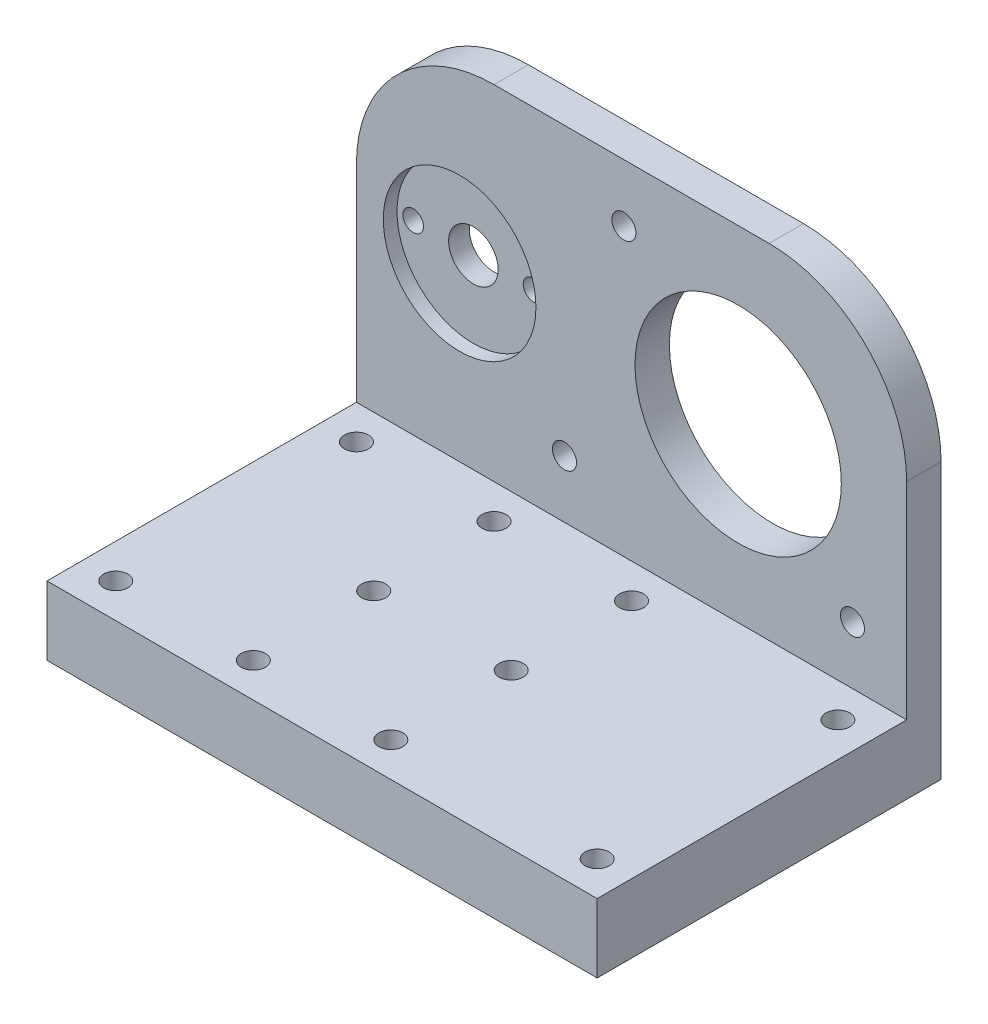
ISO-10303-21;
HEADER;
FILE_DESCRIPTION(('STEP AP214'),'2;1');
FILE_NAME('part.step','',(''),(''),'','','');
FILE_SCHEMA(('AUTOMOTIVE_DESIGN { 1 0 10303 214 1 1 1 1 }'));
ENDSEC;
DATA;
#1=APPLICATION_CONTEXT('core data for automotive mechanical design processes');
#2=APPLICATION_PROTOCOL_DEFINITION('international standard','automotive_design',2000,#1);
#3=PRODUCT_CONTEXT('',#1,'mechanical');
#4=PRODUCT('Part','Part','',(#3));
#5=PRODUCT_RELATED_PRODUCT_CATEGORY('part','',(#4));
#6=PRODUCT_DEFINITION_FORMATION('','',#4);
#7=PRODUCT_DEFINITION_CONTEXT('part definition',#1,'design');
#8=PRODUCT_DEFINITION('design','',#6,#7);
#9=PRODUCT_DEFINITION_SHAPE('','',#8);
#10=(LENGTH_UNIT() NAMED_UNIT(*) SI_UNIT(.MILLI.,.METRE.));
#11=(NAMED_UNIT(*) PLANE_ANGLE_UNIT() SI_UNIT($,.RADIAN.));
#12=(NAMED_UNIT(*) SI_UNIT($,.STERADIAN.) SOLID_ANGLE_UNIT());
#13=UNCERTAINTY_MEASURE_WITH_UNIT(LENGTH_MEASURE(1.E-05),#10,'distance_accuracy_value','');
#14=(GEOMETRIC_REPRESENTATION_CONTEXT(3) GLOBAL_UNCERTAINTY_ASSIGNED_CONTEXT((#13)) GLOBAL_UNIT_ASSIGNED_CONTEXT((#10,
#11,#12)) REPRESENTATION_CONTEXT('',''));
#15=CARTESIAN_POINT('',(0.,0.,0.));
#16=DIRECTION('',(0.,0.,1.));
#17=DIRECTION('',(1.,0.,0.));
#18=AXIS2_PLACEMENT_3D('',#15,#16,#17);
#19=CARTESIAN_POINT('',(-105.,-1.,0.));
#20=DIRECTION('',(0.,0.,1.));
#21=DIRECTION('',(1.,0.,0.));
#22=AXIS2_PLACEMENT_3D('',#19,#20,#21);
#23=CYLINDRICAL_SURFACE('',#22,3.6);
#24=CARTESIAN_POINT('',(-105.,-1.,0.));
#25=DIRECTION('',(0.,0.,1.));
#26=DIRECTION('',(1.,0.,0.));
#27=AXIS2_PLACEMENT_3D('',#24,#25,#26);
#28=CIRCLE('',#27,3.6);
#29=CARTESIAN_POINT('',(-101.4,-1.,0.));
#30=VERTEX_POINT('',#29);
#31=EDGE_CURVE('E120',#30,#30,#28,.T.);
#32=ORIENTED_EDGE('',*,*,#31,.F.);
#33=EDGE_LOOP('',(#32));
#34=FACE_BOUND('',#33,.T.);
#35=CARTESIAN_POINT('',(-105.,-1.,3.));
#36=DIRECTION('',(0.,0.,1.));
#37=DIRECTION('',(1.,0.,0.));
#38=AXIS2_PLACEMENT_3D('',#35,#36,#37);
#39=CIRCLE('',#38,3.6);
#40=CARTESIAN_POINT('',(-101.4,-1.,3.));
#41=VERTEX_POINT('',#40);
#42=EDGE_CURVE('E180',#41,#41,#39,.F.);
#43=ORIENTED_EDGE('',*,*,#42,.F.);
#44=EDGE_LOOP('',(#43));
#45=FACE_BOUND('',#44,.T.);
#46=ADVANCED_FACE('F39',(#34,#45),#23,.F.);
#47=CARTESIAN_POINT('',(-96.25,-0.999999999999999,0.));
#48=DIRECTION('',(0.,0.,1.));
#49=DIRECTION('',(1.,0.,0.));
#50=AXIS2_PLACEMENT_3D('',#47,#48,#49);
#51=CYLINDRICAL_SURFACE('',#50,1.5);
#52=CARTESIAN_POINT('',(-96.25,-0.999999999999999,0.));
#53=DIRECTION('',(0.,0.,1.));
#54=DIRECTION('',(1.,0.,0.));
#55=AXIS2_PLACEMENT_3D('',#52,#53,#54);
#56=CIRCLE('',#55,1.5);
#57=CARTESIAN_POINT('',(-94.75,-0.999999999999999,0.));
#58=VERTEX_POINT('',#57);
#59=EDGE_CURVE('E183',#58,#58,#56,.T.);
#60=ORIENTED_EDGE('',*,*,#59,.F.);
#61=EDGE_LOOP('',(#60));
#62=FACE_BOUND('',#61,.T.);
#63=CARTESIAN_POINT('',(-96.25,-0.999999999999999,3.));
#64=DIRECTION('',(0.,0.,1.));
#65=DIRECTION('',(1.,0.,0.));
#66=AXIS2_PLACEMENT_3D('',#63,#64,#65);
#67=CIRCLE('',#66,1.5);
#68=CARTESIAN_POINT('',(-94.75,-0.999999999999999,3.));
#69=VERTEX_POINT('',#68);
#70=EDGE_CURVE('E177',#69,#69,#67,.F.);
#71=ORIENTED_EDGE('',*,*,#70,.F.);
#72=EDGE_LOOP('',(#71));
#73=FACE_BOUND('',#72,.T.);
#74=ADVANCED_FACE('F262',(#62,#73),#51,.F.);
#75=CARTESIAN_POINT('',(-113.75,-1.,0.));
#76=DIRECTION('',(0.,0.,1.));
#77=DIRECTION('',(1.,0.,0.));
#78=AXIS2_PLACEMENT_3D('',#75,#76,#77);
#79=CYLINDRICAL_SURFACE('',#78,1.5);
#80=CARTESIAN_POINT('',(-113.75,-1.,0.));
#81=DIRECTION('',(0.,0.,1.));
#82=DIRECTION('',(1.,0.,0.));
#83=AXIS2_PLACEMENT_3D('',#80,#81,#82);
#84=CIRCLE('',#83,1.5);
#85=CARTESIAN_POINT('',(-112.25,-1.,0.));
#86=VERTEX_POINT('',#85);
#87=EDGE_CURVE('E184',#86,#86,#84,.T.);
#88=ORIENTED_EDGE('',*,*,#87,.F.);
#89=EDGE_LOOP('',(#88));
#90=FACE_BOUND('',#89,.T.);
#91=CARTESIAN_POINT('',(-113.75,-1.,3.));
#92=DIRECTION('',(0.,0.,1.));
#93=DIRECTION('',(1.,0.,0.));
#94=AXIS2_PLACEMENT_3D('',#91,#92,#93);
#95=CIRCLE('',#94,1.5);
#96=CARTESIAN_POINT('',(-112.25,-1.,3.));
#97=VERTEX_POINT('',#96);
#98=EDGE_CURVE('E174',#97,#97,#95,.F.);
#99=ORIENTED_EDGE('',*,*,#98,.F.);
#100=EDGE_LOOP('',(#99));
#101=FACE_BOUND('',#100,.T.);
#102=ADVANCED_FACE('F268',(#90,#101),#79,.F.);
#103=CARTESIAN_POINT('',(-120.,24.,5.));
#104=DIRECTION('',(1.,0.,0.));
#105=DIRECTION('',(0.,0.,-1.));
#106=AXIS2_PLACEMENT_3D('',#103,#104,#105);
#107=PLANE('',#106);
#108=DIRECTION('',(0.,-1.,0.));
#109=VECTOR('',#108,1.);
#110=CARTESIAN_POINT('',(-120.,24.,5.));
#111=LINE('',#110,#109);
#112=CARTESIAN_POINT('',(-120.,4.,5.));
#113=VERTEX_POINT('',#112);
#114=CARTESIAN_POINT('',(-120.,-26.,5.));
#115=VERTEX_POINT('',#114);
#116=EDGE_CURVE('E191',#113,#115,#111,.T.);
#117=ORIENTED_EDGE('',*,*,#116,.F.);
#118=DIRECTION('',(0.,0.,-1.));
#119=VECTOR('',#118,1.);
#120=CARTESIAN_POINT('',(-120.,4.,5.));
#121=LINE('',#120,#119);
#122=CARTESIAN_POINT('',(-120.,4.,0.));
#123=VERTEX_POINT('',#122);
#124=EDGE_CURVE('E117',#113,#123,#121,.T.);
#125=ORIENTED_EDGE('',*,*,#124,.T.);
#126=DIRECTION('',(0.,-1.,0.));
#127=VECTOR('',#126,1.);
#128=CARTESIAN_POINT('',(-120.,24.,0.));
#129=LINE('',#128,#127);
#130=CARTESIAN_POINT('',(-120.,-36.,0.));
#131=VERTEX_POINT('',#130);
#132=EDGE_CURVE('E109',#123,#131,#129,.T.);
#133=ORIENTED_EDGE('',*,*,#132,.T.);
#134=DIRECTION('',(0.,0.,-1.));
#135=VECTOR('',#134,1.);
#136=CARTESIAN_POINT('',(-120.,-36.,50.));
#137=LINE('',#136,#135);
#138=CARTESIAN_POINT('',(-120.,-36.,50.));
#139=VERTEX_POINT('',#138);
#140=EDGE_CURVE('E115',#139,#131,#137,.T.);
#141=ORIENTED_EDGE('',*,*,#140,.F.);
#142=DIRECTION('',(0.,1.,0.));
#143=VECTOR('',#142,1.);
#144=CARTESIAN_POINT('',(-120.,-36.,50.));
#145=LINE('',#144,#143);
#146=CARTESIAN_POINT('',(-120.,-26.,50.));
#147=VERTEX_POINT('',#146);
#148=EDGE_CURVE('E143',#139,#147,#145,.T.);
#149=ORIENTED_EDGE('',*,*,#148,.T.);
#150=DIRECTION('',(0.,0.,-1.));
#151=VECTOR('',#150,1.);
#152=CARTESIAN_POINT('',(-120.,-26.,50.));
#153=LINE('',#152,#151);
#154=EDGE_CURVE('E144',#147,#115,#153,.T.);
#155=ORIENTED_EDGE('',*,*,#154,.T.);
#156=EDGE_LOOP('',(#117,#125,#133,#141,#149,#155));
#157=FACE_BOUND('',#156,.T.);
#158=ADVANCED_FACE('F112',(#157),#107,.F.);
#159=CARTESIAN_POINT('',(-40.,24.,5.));
#160=DIRECTION('',(-1.,0.,0.));
#161=DIRECTION('',(0.,-1.,0.));
#162=AXIS2_PLACEMENT_3D('',#159,#160,#161);
#163=PLANE('',#162);
#164=DIRECTION('',(0.,1.,0.));
#165=VECTOR('',#164,1.);
#166=CARTESIAN_POINT('',(-40.,24.,0.));
#167=LINE('',#166,#165);
#168=CARTESIAN_POINT('',(-40.,-36.,0.));
#169=VERTEX_POINT('',#168);
#170=CARTESIAN_POINT('',(-40.,4.,0.));
#171=VERTEX_POINT('',#170);
#172=EDGE_CURVE('E119',#169,#171,#167,.T.);
#173=ORIENTED_EDGE('',*,*,#172,.T.);
#174=DIRECTION('',(0.,0.,-1.));
#175=VECTOR('',#174,1.);
#176=CARTESIAN_POINT('',(-40.,4.,5.));
#177=LINE('',#176,#175);
#178=CARTESIAN_POINT('',(-40.,4.,5.));
#179=VERTEX_POINT('',#178);
#180=EDGE_CURVE('E11',#171,#179,#177,.F.);
#181=ORIENTED_EDGE('',*,*,#180,.T.);
#182=DIRECTION('',(0.,1.,0.));
#183=VECTOR('',#182,1.);
#184=CARTESIAN_POINT('',(-40.,24.,5.));
#185=LINE('',#184,#183);
#186=CARTESIAN_POINT('',(-40.,-26.,5.));
#187=VERTEX_POINT('',#186);
#188=EDGE_CURVE('E197',#187,#179,#185,.T.);
#189=ORIENTED_EDGE('',*,*,#188,.F.);
#190=DIRECTION('',(0.,0.,1.));
#191=VECTOR('',#190,1.);
#192=CARTESIAN_POINT('',(-40.,-26.,50.));
#193=LINE('',#192,#191);
#194=CARTESIAN_POINT('',(-40.,-26.,50.));
#195=VERTEX_POINT('',#194);
#196=EDGE_CURVE('E135',#187,#195,#193,.T.);
#197=ORIENTED_EDGE('',*,*,#196,.T.);
#198=DIRECTION('',(0.,1.,0.));
#199=VECTOR('',#198,1.);
#200=CARTESIAN_POINT('',(-40.,-36.,50.));
#201=LINE('',#200,#199);
#202=CARTESIAN_POINT('',(-40.,-36.,50.));
#203=VERTEX_POINT('',#202);
#204=EDGE_CURVE('E149',#203,#195,#201,.T.);
#205=ORIENTED_EDGE('',*,*,#204,.F.);
#206=DIRECTION('',(0.,0.,1.));
#207=VECTOR('',#206,1.);
#208=CARTESIAN_POINT('',(-40.,-36.,50.));
#209=LINE('',#208,#207);
#210=EDGE_CURVE('E127',#169,#203,#209,.T.);
#211=ORIENTED_EDGE('',*,*,#210,.F.);
#212=EDGE_LOOP('',(#173,#181,#189,#197,#205,#211));
#213=FACE_BOUND('',#212,.T.);
#214=ADVANCED_FACE('F286',(#213),#163,.F.);
#215=CARTESIAN_POINT('',(-120.,24.,5.));
#216=DIRECTION('',(0.,-1.,0.));
#217=DIRECTION('',(0.,0.,-1.));
#218=AXIS2_PLACEMENT_3D('',#215,#216,#217);
#219=PLANE('',#218);
#220=DIRECTION('',(-1.,0.,0.));
#221=VECTOR('',#220,1.);
#222=CARTESIAN_POINT('',(-120.,24.,0.));
#223=LINE('',#222,#221);
#224=CARTESIAN_POINT('',(-60.,24.,0.));
#225=VERTEX_POINT('',#224);
#226=CARTESIAN_POINT('',(-100.,24.,0.));
#227=VERTEX_POINT('',#226);
#228=EDGE_CURVE('E194',#225,#227,#223,.T.);
#229=ORIENTED_EDGE('',*,*,#228,.T.);
#230=DIRECTION('',(0.,0.,-1.));
#231=VECTOR('',#230,1.);
#232=CARTESIAN_POINT('',(-100.,24.,5.));
#233=LINE('',#232,#231);
#234=CARTESIAN_POINT('',(-100.,24.,5.));
#235=VERTEX_POINT('',#234);
#236=EDGE_CURVE('E62',#227,#235,#233,.F.);
#237=ORIENTED_EDGE('',*,*,#236,.T.);
#238=DIRECTION('',(-1.,0.,0.));
#239=VECTOR('',#238,1.);
#240=CARTESIAN_POINT('',(-120.,24.,5.));
#241=LINE('',#240,#239);
#242=CARTESIAN_POINT('',(-60.,24.,5.));
#243=VERTEX_POINT('',#242);
#244=EDGE_CURVE('E199',#243,#235,#241,.T.);
#245=ORIENTED_EDGE('',*,*,#244,.F.);
#246=DIRECTION('',(0.,0.,-1.));
#247=VECTOR('',#246,1.);
#248=CARTESIAN_POINT('',(-60.,24.,5.));
#249=LINE('',#248,#247);
#250=EDGE_CURVE('E210',#243,#225,#249,.T.);
#251=ORIENTED_EDGE('',*,*,#250,.T.);
#252=EDGE_LOOP('',(#229,#237,#245,#251));
#253=FACE_BOUND('',#252,.T.);
#254=ADVANCED_FACE('F278',(#253),#219,.F.);
#255=CARTESIAN_POINT('',(0.,0.,5.));
#256=DIRECTION('',(0.,0.,1.));
#257=DIRECTION('',(1.,0.,0.));
#258=AXIS2_PLACEMENT_3D('',#255,#256,#257);
#259=PLANE('',#258);
#260=CARTESIAN_POINT('',(-89.75,-17.6170093578839,5.));
#261=DIRECTION('',(0.,0.,1.));
#262=DIRECTION('',(1.,0.,0.));
#263=AXIS2_PLACEMENT_3D('',#260,#261,#262);
#264=CIRCLE('',#263,1.75);
#265=CARTESIAN_POINT('',(-88.,-17.6170093578839,5.));
#266=VERTEX_POINT('',#265);
#267=EDGE_CURVE('E553',#266,#266,#264,.T.);
#268=ORIENTED_EDGE('',*,*,#267,.F.);
#269=EDGE_LOOP('',(#268));
#270=FACE_BOUND('',#269,.T.);
#271=CARTESIAN_POINT('',(-81.1170093578839,15.6170093578838,5.));
#272=DIRECTION('',(0.,0.,1.));
#273=DIRECTION('',(1.,0.,0.));
#274=AXIS2_PLACEMENT_3D('',#271,#272,#273);
#275=CIRCLE('',#274,1.75);
#276=CARTESIAN_POINT('',(-79.3670093578839,15.6170093578838,5.));
#277=VERTEX_POINT('',#276);
#278=EDGE_CURVE('E157',#277,#277,#275,.T.);
#279=ORIENTED_EDGE('',*,*,#278,.F.);
#280=EDGE_LOOP('',(#279));
#281=FACE_BOUND('',#280,.T.);
#282=CARTESIAN_POINT('',(-47.8829906421162,-17.6170093578839,5.));
#283=DIRECTION('',(0.,0.,1.));
#284=DIRECTION('',(1.,0.,0.));
#285=AXIS2_PLACEMENT_3D('',#282,#283,#284);
#286=CIRCLE('',#285,1.75);
#287=CARTESIAN_POINT('',(-46.1329906421162,-17.6170093578839,5.));
#288=VERTEX_POINT('',#287);
#289=EDGE_CURVE('E160',#288,#288,#286,.T.);
#290=ORIENTED_EDGE('',*,*,#289,.F.);
#291=EDGE_LOOP('',(#290));
#292=FACE_BOUND('',#291,.T.);
#293=CARTESIAN_POINT('',(-64.5,-1.,5.));
#294=DIRECTION('',(0.,0.,1.));
#295=DIRECTION('',(1.,0.,0.));
#296=AXIS2_PLACEMENT_3D('',#293,#294,#295);
#297=CIRCLE('',#296,15.);
#298=CARTESIAN_POINT('',(-49.5,-1.,5.));
#299=VERTEX_POINT('',#298);
#300=EDGE_CURVE('E156',#299,#299,#297,.T.);
#301=ORIENTED_EDGE('',*,*,#300,.F.);
#302=EDGE_LOOP('',(#301));
#303=FACE_BOUND('',#302,.T.);
#304=CARTESIAN_POINT('',(-105.,-1.,5.));
#305=DIRECTION('',(0.,0.,1.));
#306=DIRECTION('',(1.,0.,0.));
#307=AXIS2_PLACEMENT_3D('',#304,#305,#306);
#308=CIRCLE('',#307,11.1);
#309=CARTESIAN_POINT('',(-93.9,-1.,5.));
#310=VERTEX_POINT('',#309);
#311=EDGE_CURVE('E168',#310,#310,#308,.T.);
#312=ORIENTED_EDGE('',*,*,#311,.F.);
#313=EDGE_LOOP('',(#312));
#314=FACE_BOUND('',#313,.T.);
#315=ORIENTED_EDGE('',*,*,#244,.T.);
#316=CARTESIAN_POINT('',(-100.,4.,5.));
#317=DIRECTION('',(0.,0.,1.));
#318=DIRECTION('',(1.,0.,0.));
#319=AXIS2_PLACEMENT_3D('',#316,#317,#318);
#320=CIRCLE('',#319,20.);
#321=EDGE_CURVE('E48',#235,#113,#320,.T.);
#322=ORIENTED_EDGE('',*,*,#321,.T.);
#323=ORIENTED_EDGE('',*,*,#116,.T.);
#324=DIRECTION('',(1.,0.,0.));
#325=VECTOR('',#324,1.);
#326=CARTESIAN_POINT('',(-120.,-26.,5.));
#327=LINE('',#326,#325);
#328=EDGE_CURVE('E193',#115,#187,#327,.T.);
#329=ORIENTED_EDGE('',*,*,#328,.T.);
#330=ORIENTED_EDGE('',*,*,#188,.T.);
#331=CARTESIAN_POINT('',(-60.,4.,5.));
#332=DIRECTION('',(0.,0.,1.));
#333=DIRECTION('',(1.,0.,0.));
#334=AXIS2_PLACEMENT_3D('',#331,#332,#333);
#335=CIRCLE('',#334,20.);
#336=EDGE_CURVE('E214',#179,#243,#335,.T.);
#337=ORIENTED_EDGE('',*,*,#336,.T.);
#338=EDGE_LOOP('',(#315,#322,#323,#329,#330,#337));
#339=FACE_BOUND('',#338,.T.);
#340=ADVANCED_FACE('F275',(#270,#281,#292,#303,#314,#339),#259,.T.);
#341=CARTESIAN_POINT('',(0.,0.,0.));
#342=DIRECTION('',(0.,0.,1.));
#343=DIRECTION('',(1.,0.,0.));
#344=AXIS2_PLACEMENT_3D('',#341,#342,#343);
#345=PLANE('',#344);
#346=CARTESIAN_POINT('',(-89.75,-17.6170093578839,0.));
#347=DIRECTION('',(0.,0.,1.));
#348=DIRECTION('',(1.,0.,0.));
#349=AXIS2_PLACEMENT_3D('',#346,#347,#348);
#350=CIRCLE('',#349,1.75);
#351=CARTESIAN_POINT('',(-88.,-17.6170093578839,0.));
#352=VERTEX_POINT('',#351);
#353=EDGE_CURVE('E550',#352,#352,#350,.T.);
#354=ORIENTED_EDGE('',*,*,#353,.T.);
#355=EDGE_LOOP('',(#354));
#356=FACE_BOUND('',#355,.T.);
#357=CARTESIAN_POINT('',(-81.1170093578839,15.6170093578838,0.));
#358=DIRECTION('',(0.,0.,1.));
#359=DIRECTION('',(1.,0.,0.));
#360=AXIS2_PLACEMENT_3D('',#357,#358,#359);
#361=CIRCLE('',#360,1.75);
#362=CARTESIAN_POINT('',(-79.3670093578839,15.6170093578838,0.));
#363=VERTEX_POINT('',#362);
#364=EDGE_CURVE('E153',#363,#363,#361,.T.);
#365=ORIENTED_EDGE('',*,*,#364,.T.);
#366=EDGE_LOOP('',(#365));
#367=FACE_BOUND('',#366,.T.);
#368=CARTESIAN_POINT('',(-47.8829906421162,-17.6170093578839,0.));
#369=DIRECTION('',(0.,0.,1.));
#370=DIRECTION('',(1.,0.,0.));
#371=AXIS2_PLACEMENT_3D('',#368,#369,#370);
#372=CIRCLE('',#371,1.75);
#373=CARTESIAN_POINT('',(-46.1329906421162,-17.6170093578839,0.));
#374=VERTEX_POINT('',#373);
#375=EDGE_CURVE('E152',#374,#374,#372,.T.);
#376=ORIENTED_EDGE('',*,*,#375,.T.);
#377=EDGE_LOOP('',(#376));
#378=FACE_BOUND('',#377,.T.);
#379=CARTESIAN_POINT('',(-64.5,-1.,0.));
#380=DIRECTION('',(0.,0.,1.));
#381=DIRECTION('',(1.,0.,0.));
#382=AXIS2_PLACEMENT_3D('',#379,#380,#381);
#383=CIRCLE('',#382,15.);
#384=CARTESIAN_POINT('',(-49.5,-1.,0.));
#385=VERTEX_POINT('',#384);
#386=EDGE_CURVE('E165',#385,#385,#383,.T.);
#387=ORIENTED_EDGE('',*,*,#386,.T.);
#388=EDGE_LOOP('',(#387));
#389=FACE_BOUND('',#388,.T.);
#390=ORIENTED_EDGE('',*,*,#87,.T.);
#391=EDGE_LOOP('',(#390));
#392=FACE_BOUND('',#391,.T.);
#393=ORIENTED_EDGE('',*,*,#59,.T.);
#394=EDGE_LOOP('',(#393));
#395=FACE_BOUND('',#394,.T.);
#396=ORIENTED_EDGE('',*,*,#31,.T.);
#397=EDGE_LOOP('',(#396));
#398=FACE_BOUND('',#397,.T.);
#399=ORIENTED_EDGE('',*,*,#132,.F.);
#400=CARTESIAN_POINT('',(-100.,4.,0.));
#401=DIRECTION('',(0.,0.,1.));
#402=DIRECTION('',(1.,0.,0.));
#403=AXIS2_PLACEMENT_3D('',#400,#401,#402);
#404=CIRCLE('',#403,20.);
#405=EDGE_CURVE('E208',#123,#227,#404,.F.);
#406=ORIENTED_EDGE('',*,*,#405,.T.);
#407=ORIENTED_EDGE('',*,*,#228,.F.);
#408=CARTESIAN_POINT('',(-60.,4.,0.));
#409=DIRECTION('',(0.,0.,1.));
#410=DIRECTION('',(1.,0.,0.));
#411=AXIS2_PLACEMENT_3D('',#408,#409,#410);
#412=CIRCLE('',#411,20.);
#413=EDGE_CURVE('E206',#225,#171,#412,.F.);
#414=ORIENTED_EDGE('',*,*,#413,.T.);
#415=ORIENTED_EDGE('',*,*,#172,.F.);
#416=DIRECTION('',(1.,0.,0.));
#417=VECTOR('',#416,1.);
#418=CARTESIAN_POINT('',(-120.,-36.,0.));
#419=LINE('',#418,#417);
#420=EDGE_CURVE('E123',#131,#169,#419,.T.);
#421=ORIENTED_EDGE('',*,*,#420,.F.);
#422=EDGE_LOOP('',(#399,#406,#407,#414,#415,#421));
#423=FACE_BOUND('',#422,.T.);
#424=ADVANCED_FACE('F124',(#356,#367,#378,#389,#392,#395,#398,#423),#345,.F.);
#425=CARTESIAN_POINT('',(-105.,-1.,3.));
#426=DIRECTION('',(0.,0.,1.));
#427=DIRECTION('',(1.,0.,0.));
#428=AXIS2_PLACEMENT_3D('',#425,#426,#427);
#429=PLANE('',#428);
#430=CARTESIAN_POINT('',(-105.,-1.,3.));
#431=DIRECTION('',(0.,0.,1.));
#432=DIRECTION('',(1.,0.,0.));
#433=AXIS2_PLACEMENT_3D('',#430,#431,#432);
#434=CIRCLE('',#433,11.1);
#435=CARTESIAN_POINT('',(-93.9,-1.,3.));
#436=VERTEX_POINT('',#435);
#437=EDGE_CURVE('E171',#436,#436,#434,.T.);
#438=ORIENTED_EDGE('',*,*,#437,.T.);
#439=EDGE_LOOP('',(#438));
#440=FACE_BOUND('',#439,.T.);
#441=ORIENTED_EDGE('',*,*,#98,.T.);
#442=EDGE_LOOP('',(#441));
#443=FACE_BOUND('',#442,.T.);
#444=ORIENTED_EDGE('',*,*,#70,.T.);
#445=EDGE_LOOP('',(#444));
#446=FACE_BOUND('',#445,.T.);
#447=ORIENTED_EDGE('',*,*,#42,.T.);
#448=EDGE_LOOP('',(#447));
#449=FACE_BOUND('',#448,.T.);
#450=ADVANCED_FACE('F282',(#440,#443,#446,#449),#429,.T.);
#451=CARTESIAN_POINT('',(-105.,-1.,3.));
#452=DIRECTION('',(0.,0.,1.));
#453=DIRECTION('',(1.,0.,0.));
#454=AXIS2_PLACEMENT_3D('',#451,#452,#453);
#455=CYLINDRICAL_SURFACE('',#454,11.1);
#456=ORIENTED_EDGE('',*,*,#437,.F.);
#457=EDGE_LOOP('',(#456));
#458=FACE_BOUND('',#457,.T.);
#459=ORIENTED_EDGE('',*,*,#311,.T.);
#460=EDGE_LOOP('',(#459));
#461=FACE_BOUND('',#460,.T.);
#462=ADVANCED_FACE('F330',(#458,#461),#455,.F.);
#463=CARTESIAN_POINT('',(-64.5,-1.,0.));
#464=DIRECTION('',(0.,0.,1.));
#465=DIRECTION('',(1.,0.,0.));
#466=AXIS2_PLACEMENT_3D('',#463,#464,#465);
#467=CYLINDRICAL_SURFACE('',#466,15.);
#468=ORIENTED_EDGE('',*,*,#386,.F.);
#469=EDGE_LOOP('',(#468));
#470=FACE_BOUND('',#469,.T.);
#471=ORIENTED_EDGE('',*,*,#300,.T.);
#472=EDGE_LOOP('',(#471));
#473=FACE_BOUND('',#472,.T.);
#474=ADVANCED_FACE('F326',(#470,#473),#467,.F.);
#475=CARTESIAN_POINT('',(-47.8829906421162,-17.6170093578839,0.));
#476=DIRECTION('',(0.,0.,1.));
#477=DIRECTION('',(1.,0.,0.));
#478=AXIS2_PLACEMENT_3D('',#475,#476,#477);
#479=CYLINDRICAL_SURFACE('',#478,1.75);
#480=ORIENTED_EDGE('',*,*,#375,.F.);
#481=EDGE_LOOP('',(#480));
#482=FACE_BOUND('',#481,.T.);
#483=ORIENTED_EDGE('',*,*,#289,.T.);
#484=EDGE_LOOP('',(#483));
#485=FACE_BOUND('',#484,.T.);
#486=ADVANCED_FACE('F320',(#482,#485),#479,.F.);
#487=CARTESIAN_POINT('',(-81.1170093578839,15.6170093578838,0.));
#488=DIRECTION('',(0.,0.,1.));
#489=DIRECTION('',(1.,0.,0.));
#490=AXIS2_PLACEMENT_3D('',#487,#488,#489);
#491=CYLINDRICAL_SURFACE('',#490,1.75);
#492=ORIENTED_EDGE('',*,*,#364,.F.);
#493=EDGE_LOOP('',(#492));
#494=FACE_BOUND('',#493,.T.);
#495=ORIENTED_EDGE('',*,*,#278,.T.);
#496=EDGE_LOOP('',(#495));
#497=FACE_BOUND('',#496,.T.);
#498=ADVANCED_FACE('F312',(#494,#497),#491,.F.);
#499=CARTESIAN_POINT('',(-120.,-36.,50.));
#500=DIRECTION('',(0.,0.,-1.));
#501=DIRECTION('',(-1.,0.,0.));
#502=AXIS2_PLACEMENT_3D('',#499,#500,#501);
#503=PLANE('',#502);
#504=DIRECTION('',(-1.,0.,0.));
#505=VECTOR('',#504,1.);
#506=CARTESIAN_POINT('',(-120.,-26.,50.));
#507=LINE('',#506,#505);
#508=EDGE_CURVE('E133',#195,#147,#507,.T.);
#509=ORIENTED_EDGE('',*,*,#508,.T.);
#510=ORIENTED_EDGE('',*,*,#148,.F.);
#511=DIRECTION('',(-1.,0.,0.));
#512=VECTOR('',#511,1.);
#513=CARTESIAN_POINT('',(-120.,-36.,50.));
#514=LINE('',#513,#512);
#515=EDGE_CURVE('E131',#203,#139,#514,.T.);
#516=ORIENTED_EDGE('',*,*,#515,.F.);
#517=ORIENTED_EDGE('',*,*,#204,.T.);
#518=EDGE_LOOP('',(#509,#510,#516,#517));
#519=FACE_BOUND('',#518,.T.);
#520=ADVANCED_FACE('F310',(#519),#503,.F.);
#521=CARTESIAN_POINT('',(0.,-36.,0.));
#522=DIRECTION('',(0.,-1.,0.));
#523=DIRECTION('',(0.,0.,-1.));
#524=AXIS2_PLACEMENT_3D('',#521,#522,#523);
#525=PLANE('',#524);
#526=CARTESIAN_POINT('',(-74.9999999999996,-36.,27.5));
#527=DIRECTION('',(0.,1.,0.));
#528=DIRECTION('',(0.,0.,1.));
#529=AXIS2_PLACEMENT_3D('',#526,#527,#528);
#530=CIRCLE('',#529,1.75);
#531=CARTESIAN_POINT('',(-74.9999999999996,-36.,29.25));
#532=VERTEX_POINT('',#531);
#533=EDGE_CURVE('E558',#532,#532,#530,.T.);
#534=ORIENTED_EDGE('',*,*,#533,.T.);
#535=EDGE_LOOP('',(#534));
#536=FACE_BOUND('',#535,.T.);
#537=CARTESIAN_POINT('',(-94.9999999999997,-36.,27.5));
#538=DIRECTION('',(0.,1.,0.));
#539=DIRECTION('',(0.,0.,1.));
#540=AXIS2_PLACEMENT_3D('',#537,#538,#539);
#541=CIRCLE('',#540,1.75);
#542=CARTESIAN_POINT('',(-94.9999999999997,-36.,29.25));
#543=VERTEX_POINT('',#542);
#544=EDGE_CURVE('E555',#543,#543,#541,.T.);
#545=ORIENTED_EDGE('',*,*,#544,.T.);
#546=EDGE_LOOP('',(#545));
#547=FACE_BOUND('',#546,.T.);
#548=CARTESIAN_POINT('',(-45.,-36.,10.));
#549=DIRECTION('',(0.,1.,0.));
#550=DIRECTION('',(0.,0.,1.));
#551=AXIS2_PLACEMENT_3D('',#548,#549,#550);
#552=CIRCLE('',#551,1.75);
#553=CARTESIAN_POINT('',(-45.,-36.,11.75));
#554=VERTEX_POINT('',#553);
#555=EDGE_CURVE('E579',#554,#554,#552,.T.);
#556=ORIENTED_EDGE('',*,*,#555,.T.);
#557=EDGE_LOOP('',(#556));
#558=FACE_BOUND('',#557,.T.);
#559=CARTESIAN_POINT('',(-44.9999999999997,-36.,45.));
#560=DIRECTION('',(0.,1.,0.));
#561=DIRECTION('',(0.,0.,1.));
#562=AXIS2_PLACEMENT_3D('',#559,#560,#561);
#563=CIRCLE('',#562,1.75);
#564=CARTESIAN_POINT('',(-44.9999999999997,-36.,46.75));
#565=VERTEX_POINT('',#564);
#566=EDGE_CURVE('E582',#565,#565,#563,.T.);
#567=ORIENTED_EDGE('',*,*,#566,.T.);
#568=EDGE_LOOP('',(#567));
#569=FACE_BOUND('',#568,.T.);
#570=CARTESIAN_POINT('',(-115.,-36.,45.));
#571=DIRECTION('',(0.,1.,0.));
#572=DIRECTION('',(0.,0.,1.));
#573=AXIS2_PLACEMENT_3D('',#570,#571,#572);
#574=CIRCLE('',#573,1.75);
#575=CARTESIAN_POINT('',(-115.,-36.,46.75));
#576=VERTEX_POINT('',#575);
#577=EDGE_CURVE('E585',#576,#576,#574,.T.);
#578=ORIENTED_EDGE('',*,*,#577,.T.);
#579=EDGE_LOOP('',(#578));
#580=FACE_BOUND('',#579,.T.);
#581=CARTESIAN_POINT('',(-95.,-36.,10.));
#582=DIRECTION('',(0.,1.,0.));
#583=DIRECTION('',(0.,0.,1.));
#584=AXIS2_PLACEMENT_3D('',#581,#582,#583);
#585=CIRCLE('',#584,1.75);
#586=CARTESIAN_POINT('',(-95.,-36.,11.75));
#587=VERTEX_POINT('',#586);
#588=EDGE_CURVE('E576',#587,#587,#585,.T.);
#589=ORIENTED_EDGE('',*,*,#588,.T.);
#590=EDGE_LOOP('',(#589));
#591=FACE_BOUND('',#590,.T.);
#592=CARTESIAN_POINT('',(-74.9999999999996,-36.,45.));
#593=DIRECTION('',(0.,1.,0.));
#594=DIRECTION('',(0.,0.,1.));
#595=AXIS2_PLACEMENT_3D('',#592,#593,#594);
#596=CIRCLE('',#595,1.74999999999998);
#597=CARTESIAN_POINT('',(-74.9999999999996,-36.,46.75));
#598=VERTEX_POINT('',#597);
#599=EDGE_CURVE('E561',#598,#598,#596,.T.);
#600=ORIENTED_EDGE('',*,*,#599,.T.);
#601=EDGE_LOOP('',(#600));
#602=FACE_BOUND('',#601,.T.);
#603=CARTESIAN_POINT('',(-75.,-36.,10.));
#604=DIRECTION('',(0.,1.,0.));
#605=DIRECTION('',(0.,0.,1.));
#606=AXIS2_PLACEMENT_3D('',#603,#604,#605);
#607=CIRCLE('',#606,1.74999999999998);
#608=CARTESIAN_POINT('',(-75.,-36.,11.75));
#609=VERTEX_POINT('',#608);
#610=EDGE_CURVE('E572',#609,#609,#607,.T.);
#611=ORIENTED_EDGE('',*,*,#610,.T.);
#612=EDGE_LOOP('',(#611));
#613=FACE_BOUND('',#612,.T.);
#614=CARTESIAN_POINT('',(-94.9999999999997,-36.,45.));
#615=DIRECTION('',(0.,1.,0.));
#616=DIRECTION('',(0.,0.,1.));
#617=AXIS2_PLACEMENT_3D('',#614,#615,#616);
#618=CIRCLE('',#617,1.75);
#619=CARTESIAN_POINT('',(-94.9999999999997,-36.,46.75));
#620=VERTEX_POINT('',#619);
#621=EDGE_CURVE('E573',#620,#620,#618,.T.);
#622=ORIENTED_EDGE('',*,*,#621,.T.);
#623=EDGE_LOOP('',(#622));
#624=FACE_BOUND('',#623,.T.);
#625=CARTESIAN_POINT('',(-115.,-36.,10.));
#626=DIRECTION('',(0.,1.,0.));
#627=DIRECTION('',(0.,0.,1.));
#628=AXIS2_PLACEMENT_3D('',#625,#626,#627);
#629=CIRCLE('',#628,1.75);
#630=CARTESIAN_POINT('',(-115.,-36.,11.75));
#631=VERTEX_POINT('',#630);
#632=EDGE_CURVE('E138',#631,#631,#629,.T.);
#633=ORIENTED_EDGE('',*,*,#632,.T.);
#634=EDGE_LOOP('',(#633));
#635=FACE_BOUND('',#634,.T.);
#636=ORIENTED_EDGE('',*,*,#140,.T.);
#637=ORIENTED_EDGE('',*,*,#420,.T.);
#638=ORIENTED_EDGE('',*,*,#210,.T.);
#639=ORIENTED_EDGE('',*,*,#515,.T.);
#640=EDGE_LOOP('',(#636,#637,#638,#639));
#641=FACE_BOUND('',#640,.T.);
#642=ADVANCED_FACE('F129',(#536,#547,#558,#569,#580,#591,#602,#613,#624,#635,#641),#525,.T.);
#643=CARTESIAN_POINT('',(0.,-26.,0.));
#644=DIRECTION('',(0.,-1.,0.));
#645=DIRECTION('',(0.,0.,-1.));
#646=AXIS2_PLACEMENT_3D('',#643,#644,#645);
#647=PLANE('',#646);
#648=CARTESIAN_POINT('',(-74.9999999999996,-26.,27.5));
#649=DIRECTION('',(0.,1.,0.));
#650=DIRECTION('',(0.,0.,1.));
#651=AXIS2_PLACEMENT_3D('',#648,#649,#650);
#652=CIRCLE('',#651,1.75);
#653=CARTESIAN_POINT('',(-74.9999999999996,-26.,29.25));
#654=VERTEX_POINT('',#653);
#655=EDGE_CURVE('E562',#654,#654,#652,.T.);
#656=ORIENTED_EDGE('',*,*,#655,.F.);
#657=EDGE_LOOP('',(#656));
#658=FACE_BOUND('',#657,.T.);
#659=CARTESIAN_POINT('',(-94.9999999999997,-26.,27.5));
#660=DIRECTION('',(0.,1.,0.));
#661=DIRECTION('',(0.,0.,1.));
#662=AXIS2_PLACEMENT_3D('',#659,#660,#661);
#663=CIRCLE('',#662,1.75);
#664=CARTESIAN_POINT('',(-94.9999999999997,-26.,29.25));
#665=VERTEX_POINT('',#664);
#666=EDGE_CURVE('E565',#665,#665,#663,.T.);
#667=ORIENTED_EDGE('',*,*,#666,.F.);
#668=EDGE_LOOP('',(#667));
#669=FACE_BOUND('',#668,.T.);
#670=CARTESIAN_POINT('',(-45.,-26.,10.));
#671=DIRECTION('',(0.,-1.,0.));
#672=DIRECTION('',(0.,0.,-1.));
#673=AXIS2_PLACEMENT_3D('',#670,#671,#672);
#674=CIRCLE('',#673,1.75);
#675=CARTESIAN_POINT('',(-45.,-26.,8.25));
#676=VERTEX_POINT('',#675);
#677=EDGE_CURVE('E43',#676,#676,#674,.T.);
#678=ORIENTED_EDGE('',*,*,#677,.T.);
#679=EDGE_LOOP('',(#678));
#680=FACE_BOUND('',#679,.T.);
#681=CARTESIAN_POINT('',(-44.9999999999997,-26.,45.));
#682=DIRECTION('',(0.,-1.,0.));
#683=DIRECTION('',(0.,0.,-1.));
#684=AXIS2_PLACEMENT_3D('',#681,#682,#683);
#685=CIRCLE('',#684,1.75);
#686=CARTESIAN_POINT('',(-44.9999999999997,-26.,43.25));
#687=VERTEX_POINT('',#686);
#688=EDGE_CURVE('E234',#687,#687,#685,.T.);
#689=ORIENTED_EDGE('',*,*,#688,.T.);
#690=EDGE_LOOP('',(#689));
#691=FACE_BOUND('',#690,.T.);
#692=CARTESIAN_POINT('',(-115.,-26.,45.));
#693=DIRECTION('',(0.,-1.,0.));
#694=DIRECTION('',(0.,0.,-1.));
#695=AXIS2_PLACEMENT_3D('',#692,#693,#694);
#696=CIRCLE('',#695,1.75);
#697=CARTESIAN_POINT('',(-115.,-26.,43.25));
#698=VERTEX_POINT('',#697);
#699=EDGE_CURVE('E232',#698,#698,#696,.T.);
#700=ORIENTED_EDGE('',*,*,#699,.T.);
#701=EDGE_LOOP('',(#700));
#702=FACE_BOUND('',#701,.T.);
#703=CARTESIAN_POINT('',(-95.,-26.,10.));
#704=DIRECTION('',(0.,-1.,0.));
#705=DIRECTION('',(0.,0.,-1.));
#706=AXIS2_PLACEMENT_3D('',#703,#704,#705);
#707=CIRCLE('',#706,1.75);
#708=CARTESIAN_POINT('',(-95.,-26.,8.25));
#709=VERTEX_POINT('',#708);
#710=EDGE_CURVE('E229',#709,#709,#707,.T.);
#711=ORIENTED_EDGE('',*,*,#710,.T.);
#712=EDGE_LOOP('',(#711));
#713=FACE_BOUND('',#712,.T.);
#714=CARTESIAN_POINT('',(-74.9999999999996,-26.,45.));
#715=DIRECTION('',(0.,-1.,0.));
#716=DIRECTION('',(0.,0.,-1.));
#717=AXIS2_PLACEMENT_3D('',#714,#715,#716);
#718=CIRCLE('',#717,1.74999999999998);
#719=CARTESIAN_POINT('',(-74.9999999999996,-26.,43.25));
#720=VERTEX_POINT('',#719);
#721=EDGE_CURVE('E226',#720,#720,#718,.T.);
#722=ORIENTED_EDGE('',*,*,#721,.T.);
#723=EDGE_LOOP('',(#722));
#724=FACE_BOUND('',#723,.T.);
#725=CARTESIAN_POINT('',(-75.,-26.,10.));
#726=DIRECTION('',(0.,-1.,0.));
#727=DIRECTION('',(0.,0.,-1.));
#728=AXIS2_PLACEMENT_3D('',#725,#726,#727);
#729=CIRCLE('',#728,1.74999999999998);
#730=CARTESIAN_POINT('',(-75.,-26.,8.25000000000002));
#731=VERTEX_POINT('',#730);
#732=EDGE_CURVE('E223',#731,#731,#729,.T.);
#733=ORIENTED_EDGE('',*,*,#732,.T.);
#734=EDGE_LOOP('',(#733));
#735=FACE_BOUND('',#734,.T.);
#736=CARTESIAN_POINT('',(-94.9999999999997,-26.,45.));
#737=DIRECTION('',(0.,-1.,0.));
#738=DIRECTION('',(0.,0.,-1.));
#739=AXIS2_PLACEMENT_3D('',#736,#737,#738);
#740=CIRCLE('',#739,1.75);
#741=CARTESIAN_POINT('',(-94.9999999999997,-26.,43.25));
#742=VERTEX_POINT('',#741);
#743=EDGE_CURVE('E220',#742,#742,#740,.T.);
#744=ORIENTED_EDGE('',*,*,#743,.T.);
#745=EDGE_LOOP('',(#744));
#746=FACE_BOUND('',#745,.T.);
#747=CARTESIAN_POINT('',(-115.,-26.,10.));
#748=DIRECTION('',(0.,-1.,0.));
#749=DIRECTION('',(0.,0.,-1.));
#750=AXIS2_PLACEMENT_3D('',#747,#748,#749);
#751=CIRCLE('',#750,1.75);
#752=CARTESIAN_POINT('',(-115.,-26.,8.25));
#753=VERTEX_POINT('',#752);
#754=EDGE_CURVE('E217',#753,#753,#751,.T.);
#755=ORIENTED_EDGE('',*,*,#754,.T.);
#756=EDGE_LOOP('',(#755));
#757=FACE_BOUND('',#756,.T.);
#758=ORIENTED_EDGE('',*,*,#328,.F.);
#759=ORIENTED_EDGE('',*,*,#154,.F.);
#760=ORIENTED_EDGE('',*,*,#508,.F.);
#761=ORIENTED_EDGE('',*,*,#196,.F.);
#762=EDGE_LOOP('',(#758,#759,#760,#761));
#763=FACE_BOUND('',#762,.T.);
#764=ADVANCED_FACE('F241',(#658,#669,#680,#691,#702,#713,#724,#735,#746,#757,#763),#647,.F.);
#765=CARTESIAN_POINT('',(-100.,4.,5.));
#766=DIRECTION('',(0.,0.,-1.));
#767=DIRECTION('',(-1.,0.,0.));
#768=AXIS2_PLACEMENT_3D('',#765,#766,#767);
#769=CYLINDRICAL_SURFACE('',#768,20.);
#770=ORIENTED_EDGE('',*,*,#321,.F.);
#771=ORIENTED_EDGE('',*,*,#236,.F.);
#772=ORIENTED_EDGE('',*,*,#405,.F.);
#773=ORIENTED_EDGE('',*,*,#124,.F.);
#774=EDGE_LOOP('',(#770,#771,#772,#773));
#775=FACE_BOUND('',#774,.T.);
#776=ADVANCED_FACE('F290',(#775),#769,.T.);
#777=CARTESIAN_POINT('',(-60.,4.,5.));
#778=DIRECTION('',(0.,0.,-1.));
#779=DIRECTION('',(-1.,0.,0.));
#780=AXIS2_PLACEMENT_3D('',#777,#778,#779);
#781=CYLINDRICAL_SURFACE('',#780,20.);
#782=ORIENTED_EDGE('',*,*,#336,.F.);
#783=ORIENTED_EDGE('',*,*,#180,.F.);
#784=ORIENTED_EDGE('',*,*,#413,.F.);
#785=ORIENTED_EDGE('',*,*,#250,.F.);
#786=EDGE_LOOP('',(#782,#783,#784,#785));
#787=FACE_BOUND('',#786,.T.);
#788=ADVANCED_FACE('F41',(#787),#781,.T.);
#789=CARTESIAN_POINT('',(-115.,-36.,10.));
#790=DIRECTION('',(0.,1.,0.));
#791=DIRECTION('',(0.,0.,1.));
#792=AXIS2_PLACEMENT_3D('',#789,#790,#791);
#793=CYLINDRICAL_SURFACE('',#792,1.75);
#794=ORIENTED_EDGE('',*,*,#632,.F.);
#795=EDGE_LOOP('',(#794));
#796=FACE_BOUND('',#795,.T.);
#797=ORIENTED_EDGE('',*,*,#754,.F.);
#798=EDGE_LOOP('',(#797));
#799=FACE_BOUND('',#798,.T.);
#800=ADVANCED_FACE('F297',(#796,#799),#793,.F.);
#801=CARTESIAN_POINT('',(-94.9999999999997,-36.,45.));
#802=DIRECTION('',(0.,1.,0.));
#803=DIRECTION('',(0.,0.,1.));
#804=AXIS2_PLACEMENT_3D('',#801,#802,#803);
#805=CYLINDRICAL_SURFACE('',#804,1.75);
#806=ORIENTED_EDGE('',*,*,#621,.F.);
#807=EDGE_LOOP('',(#806));
#808=FACE_BOUND('',#807,.T.);
#809=ORIENTED_EDGE('',*,*,#743,.F.);
#810=EDGE_LOOP('',(#809));
#811=FACE_BOUND('',#810,.T.);
#812=ADVANCED_FACE('F450',(#808,#811),#805,.F.);
#813=CARTESIAN_POINT('',(-75.,-36.,10.));
#814=DIRECTION('',(0.,1.,0.));
#815=DIRECTION('',(0.,0.,1.));
#816=AXIS2_PLACEMENT_3D('',#813,#814,#815);
#817=CYLINDRICAL_SURFACE('',#816,1.74999999999998);
#818=ORIENTED_EDGE('',*,*,#610,.F.);
#819=EDGE_LOOP('',(#818));
#820=FACE_BOUND('',#819,.T.);
#821=ORIENTED_EDGE('',*,*,#732,.F.);
#822=EDGE_LOOP('',(#821));
#823=FACE_BOUND('',#822,.T.);
#824=ADVANCED_FACE('F461',(#820,#823),#817,.F.);
#825=CARTESIAN_POINT('',(-74.9999999999996,-36.,45.));
#826=DIRECTION('',(0.,1.,0.));
#827=DIRECTION('',(0.,0.,1.));
#828=AXIS2_PLACEMENT_3D('',#825,#826,#827);
#829=CYLINDRICAL_SURFACE('',#828,1.74999999999998);
#830=ORIENTED_EDGE('',*,*,#599,.F.);
#831=EDGE_LOOP('',(#830));
#832=FACE_BOUND('',#831,.T.);
#833=ORIENTED_EDGE('',*,*,#721,.F.);
#834=EDGE_LOOP('',(#833));
#835=FACE_BOUND('',#834,.T.);
#836=ADVANCED_FACE('F472',(#832,#835),#829,.F.);
#837=CARTESIAN_POINT('',(-95.,-36.,10.));
#838=DIRECTION('',(0.,1.,0.));
#839=DIRECTION('',(0.,0.,1.));
#840=AXIS2_PLACEMENT_3D('',#837,#838,#839);
#841=CYLINDRICAL_SURFACE('',#840,1.75);
#842=ORIENTED_EDGE('',*,*,#588,.F.);
#843=EDGE_LOOP('',(#842));
#844=FACE_BOUND('',#843,.T.);
#845=ORIENTED_EDGE('',*,*,#710,.F.);
#846=EDGE_LOOP('',(#845));
#847=FACE_BOUND('',#846,.T.);
#848=ADVANCED_FACE('F482',(#844,#847),#841,.F.);
#849=CARTESIAN_POINT('',(-115.,-36.,45.));
#850=DIRECTION('',(0.,1.,0.));
#851=DIRECTION('',(0.,0.,1.));
#852=AXIS2_PLACEMENT_3D('',#849,#850,#851);
#853=CYLINDRICAL_SURFACE('',#852,1.75);
#854=ORIENTED_EDGE('',*,*,#577,.F.);
#855=EDGE_LOOP('',(#854));
#856=FACE_BOUND('',#855,.T.);
#857=ORIENTED_EDGE('',*,*,#699,.F.);
#858=EDGE_LOOP('',(#857));
#859=FACE_BOUND('',#858,.T.);
#860=ADVANCED_FACE('F256',(#856,#859),#853,.F.);
#861=CARTESIAN_POINT('',(-44.9999999999997,-36.,45.));
#862=DIRECTION('',(0.,1.,0.));
#863=DIRECTION('',(0.,0.,1.));
#864=AXIS2_PLACEMENT_3D('',#861,#862,#863);
#865=CYLINDRICAL_SURFACE('',#864,1.75);
#866=ORIENTED_EDGE('',*,*,#566,.F.);
#867=EDGE_LOOP('',(#866));
#868=FACE_BOUND('',#867,.T.);
#869=ORIENTED_EDGE('',*,*,#688,.F.);
#870=EDGE_LOOP('',(#869));
#871=FACE_BOUND('',#870,.T.);
#872=ADVANCED_FACE('F246',(#868,#871),#865,.F.);
#873=CARTESIAN_POINT('',(-45.,-36.,10.));
#874=DIRECTION('',(0.,1.,0.));
#875=DIRECTION('',(0.,0.,1.));
#876=AXIS2_PLACEMENT_3D('',#873,#874,#875);
#877=CYLINDRICAL_SURFACE('',#876,1.75);
#878=ORIENTED_EDGE('',*,*,#555,.F.);
#879=EDGE_LOOP('',(#878));
#880=FACE_BOUND('',#879,.T.);
#881=ORIENTED_EDGE('',*,*,#677,.F.);
#882=EDGE_LOOP('',(#881));
#883=FACE_BOUND('',#882,.T.);
#884=ADVANCED_FACE('F243',(#880,#883),#877,.F.);
#885=CARTESIAN_POINT('',(-94.9999999999997,-36.,27.5));
#886=DIRECTION('',(0.,1.,0.));
#887=DIRECTION('',(0.,0.,1.));
#888=AXIS2_PLACEMENT_3D('',#885,#886,#887);
#889=CYLINDRICAL_SURFACE('',#888,1.75);
#890=ORIENTED_EDGE('',*,*,#544,.F.);
#891=EDGE_LOOP('',(#890));
#892=FACE_BOUND('',#891,.T.);
#893=ORIENTED_EDGE('',*,*,#666,.T.);
#894=EDGE_LOOP('',(#893));
#895=FACE_BOUND('',#894,.T.);
#896=ADVANCED_FACE('F245',(#892,#895),#889,.F.);
#897=CARTESIAN_POINT('',(-74.9999999999996,-36.,27.5));
#898=DIRECTION('',(0.,1.,0.));
#899=DIRECTION('',(0.,0.,1.));
#900=AXIS2_PLACEMENT_3D('',#897,#898,#899);
#901=CYLINDRICAL_SURFACE('',#900,1.75);
#902=ORIENTED_EDGE('',*,*,#533,.F.);
#903=EDGE_LOOP('',(#902));
#904=FACE_BOUND('',#903,.T.);
#905=ORIENTED_EDGE('',*,*,#655,.T.);
#906=EDGE_LOOP('',(#905));
#907=FACE_BOUND('',#906,.T.);
#908=ADVANCED_FACE('F253',(#904,#907),#901,.F.);
#909=CARTESIAN_POINT('',(-89.75,-17.6170093578839,0.));
#910=DIRECTION('',(0.,0.,1.));
#911=DIRECTION('',(1.,0.,0.));
#912=AXIS2_PLACEMENT_3D('',#909,#910,#911);
#913=CYLINDRICAL_SURFACE('',#912,1.75);
#914=ORIENTED_EDGE('',*,*,#353,.F.);
#915=EDGE_LOOP('',(#914));
#916=FACE_BOUND('',#915,.T.);
#917=ORIENTED_EDGE('',*,*,#267,.T.);
#918=EDGE_LOOP('',(#917));
#919=FACE_BOUND('',#918,.T.);
#920=ADVANCED_FACE('F531',(#916,#919),#913,.F.);
#921=CLOSED_SHELL('',(#46,#74,#102,#158,#214,#254,#340,#424,#450,#462,#474,#486,#498,#520,#642,
#764,#776,#788,#800,#812,#824,#836,#848,#860,#872,#884,#896,#908,#920));
#922=MANIFOLD_SOLID_BREP('B2',#921);
#923=ADVANCED_BREP_SHAPE_REPRESENTATION('',(#18,#922),#14);
#924=SHAPE_DEFINITION_REPRESENTATION(#9,#923);
ENDSEC;
END-ISO-10303-21;
